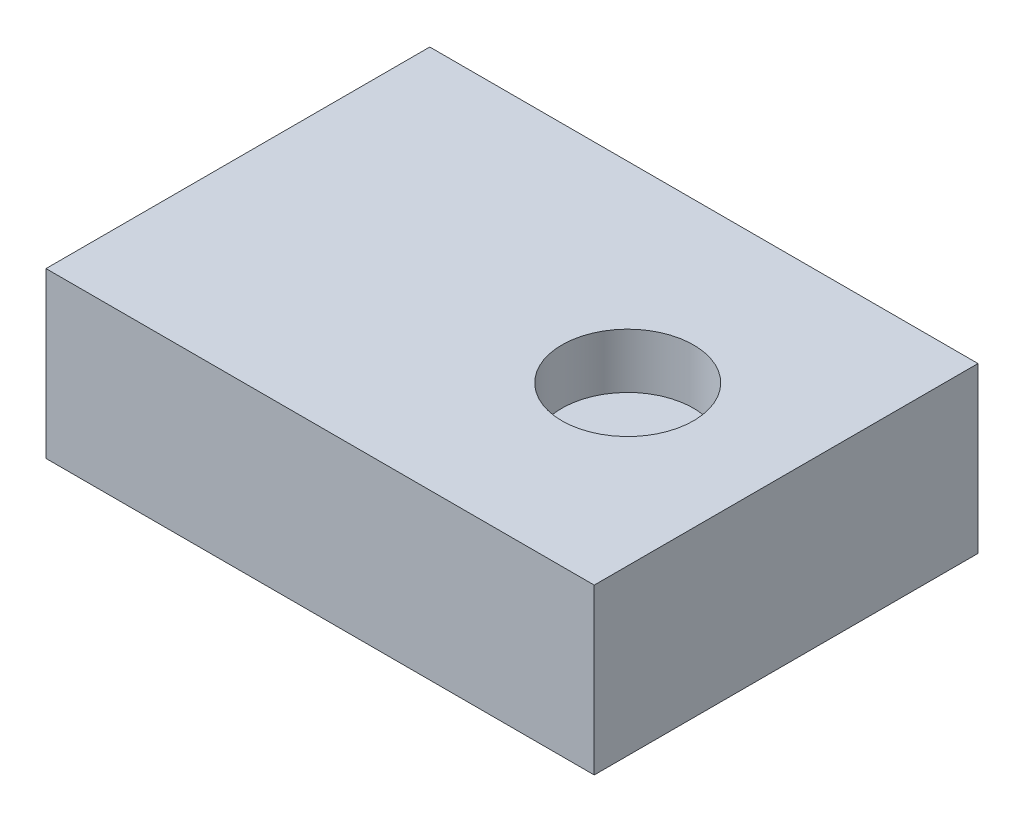
ISO-10303-21;
HEADER;
FILE_DESCRIPTION(('STEP AP214'),'2;1');
FILE_NAME('part.step','',(''),(''),'','','');
FILE_SCHEMA(('AUTOMOTIVE_DESIGN { 1 0 10303 214 1 1 1 1 }'));
ENDSEC;
DATA;
#1=APPLICATION_CONTEXT('core data for automotive mechanical design processes');
#2=APPLICATION_PROTOCOL_DEFINITION('international standard','automotive_design',2000,#1);
#3=PRODUCT_CONTEXT('',#1,'mechanical');
#4=PRODUCT('Part','Part','',(#3));
#5=PRODUCT_RELATED_PRODUCT_CATEGORY('part','',(#4));
#6=PRODUCT_DEFINITION_FORMATION('','',#4);
#7=PRODUCT_DEFINITION_CONTEXT('part definition',#1,'design');
#8=PRODUCT_DEFINITION('design','',#6,#7);
#9=PRODUCT_DEFINITION_SHAPE('','',#8);
#10=(LENGTH_UNIT() NAMED_UNIT(*) SI_UNIT(.MILLI.,.METRE.));
#11=(NAMED_UNIT(*) PLANE_ANGLE_UNIT() SI_UNIT($,.RADIAN.));
#12=(NAMED_UNIT(*) SI_UNIT($,.STERADIAN.) SOLID_ANGLE_UNIT());
#13=UNCERTAINTY_MEASURE_WITH_UNIT(LENGTH_MEASURE(1.E-05),#10,'distance_accuracy_value','');
#14=(GEOMETRIC_REPRESENTATION_CONTEXT(3) GLOBAL_UNCERTAINTY_ASSIGNED_CONTEXT((#13)) GLOBAL_UNIT_ASSIGNED_CONTEXT((#10,
#11,#12)) REPRESENTATION_CONTEXT('',''));
#15=CARTESIAN_POINT('',(0.,0.,0.));
#16=DIRECTION('',(0.,0.,1.));
#17=DIRECTION('',(1.,0.,0.));
#18=AXIS2_PLACEMENT_3D('',#15,#16,#17);
#19=CARTESIAN_POINT('',(-63.0679314748491,30.,-51.729247319518));
#20=DIRECTION('',(1.,0.,0.));
#21=DIRECTION('',(0.,0.,-1.));
#22=AXIS2_PLACEMENT_3D('',#19,#20,#21);
#23=PLANE('',#22);
#24=DIRECTION('',(0.,0.,1.));
#25=VECTOR('',#24,1.);
#26=CARTESIAN_POINT('',(-63.0679314748491,0.,-51.729247319518));
#27=LINE('',#26,#25);
#28=CARTESIAN_POINT('',(-63.0679314748491,0.,-51.729247319518));
#29=VERTEX_POINT('',#28);
#30=CARTESIAN_POINT('',(-63.0679314748491,0.,18.270752680482));
#31=VERTEX_POINT('',#30);
#32=EDGE_CURVE('E100',#29,#31,#27,.T.);
#33=ORIENTED_EDGE('',*,*,#32,.T.);
#34=DIRECTION('',(0.,-1.,0.));
#35=VECTOR('',#34,1.);
#36=CARTESIAN_POINT('',(-63.0679314748491,30.,18.270752680482));
#37=LINE('',#36,#35);
#38=CARTESIAN_POINT('',(-63.0679314748491,30.,18.270752680482));
#39=VERTEX_POINT('',#38);
#40=EDGE_CURVE('E11',#39,#31,#37,.T.);
#41=ORIENTED_EDGE('',*,*,#40,.F.);
#42=DIRECTION('',(0.,0.,1.));
#43=VECTOR('',#42,1.);
#44=CARTESIAN_POINT('',(-63.0679314748491,30.,-51.729247319518));
#45=LINE('',#44,#43);
#46=CARTESIAN_POINT('',(-63.0679314748491,30.,-51.729247319518));
#47=VERTEX_POINT('',#46);
#48=EDGE_CURVE('E88',#47,#39,#45,.T.);
#49=ORIENTED_EDGE('',*,*,#48,.F.);
#50=DIRECTION('',(0.,-1.,0.));
#51=VECTOR('',#50,1.);
#52=CARTESIAN_POINT('',(-63.0679314748491,30.,-51.729247319518));
#53=LINE('',#52,#51);
#54=EDGE_CURVE('E96',#47,#29,#53,.T.);
#55=ORIENTED_EDGE('',*,*,#54,.T.);
#56=EDGE_LOOP('',(#33,#41,#49,#55));
#57=FACE_BOUND('',#56,.T.);
#58=ADVANCED_FACE('F37',(#57),#23,.F.);
#59=CARTESIAN_POINT('',(-63.0679314748491,30.,18.270752680482));
#60=DIRECTION('',(0.,0.,-1.));
#61=DIRECTION('',(-1.,0.,0.));
#62=AXIS2_PLACEMENT_3D('',#59,#60,#61);
#63=PLANE('',#62);
#64=DIRECTION('',(1.,0.,0.));
#65=VECTOR('',#64,1.);
#66=CARTESIAN_POINT('',(-63.0679314748491,0.,18.270752680482));
#67=LINE('',#66,#65);
#68=CARTESIAN_POINT('',(36.9320685251509,0.,18.270752680482));
#69=VERTEX_POINT('',#68);
#70=EDGE_CURVE('E92',#31,#69,#67,.T.);
#71=ORIENTED_EDGE('',*,*,#70,.T.);
#72=DIRECTION('',(0.,-1.,0.));
#73=VECTOR('',#72,1.);
#74=CARTESIAN_POINT('',(36.9320685251509,30.,18.270752680482));
#75=LINE('',#74,#73);
#76=CARTESIAN_POINT('',(36.9320685251509,30.,18.270752680482));
#77=VERTEX_POINT('',#76);
#78=EDGE_CURVE('E45',#77,#69,#75,.T.);
#79=ORIENTED_EDGE('',*,*,#78,.F.);
#80=DIRECTION('',(1.,0.,0.));
#81=VECTOR('',#80,1.);
#82=CARTESIAN_POINT('',(-63.0679314748491,30.,18.270752680482));
#83=LINE('',#82,#81);
#84=EDGE_CURVE('E83',#39,#77,#83,.T.);
#85=ORIENTED_EDGE('',*,*,#84,.F.);
#86=ORIENTED_EDGE('',*,*,#40,.T.);
#87=EDGE_LOOP('',(#71,#79,#85,#86));
#88=FACE_BOUND('',#87,.T.);
#89=ADVANCED_FACE('F91',(#88),#63,.F.);
#90=CARTESIAN_POINT('',(36.9320685251509,30.,-51.729247319518));
#91=DIRECTION('',(-1.,0.,0.));
#92=DIRECTION('',(0.,0.,1.));
#93=AXIS2_PLACEMENT_3D('',#90,#91,#92);
#94=PLANE('',#93);
#95=DIRECTION('',(0.,0.,-1.));
#96=VECTOR('',#95,1.);
#97=CARTESIAN_POINT('',(36.9320685251509,0.,-51.729247319518));
#98=LINE('',#97,#96);
#99=CARTESIAN_POINT('',(36.9320685251509,0.,-51.729247319518));
#100=VERTEX_POINT('',#99);
#101=EDGE_CURVE('E70',#69,#100,#98,.T.);
#102=ORIENTED_EDGE('',*,*,#101,.T.);
#103=DIRECTION('',(0.,-1.,0.));
#104=VECTOR('',#103,1.);
#105=CARTESIAN_POINT('',(36.9320685251509,30.,-51.729247319518));
#106=LINE('',#105,#104);
#107=CARTESIAN_POINT('',(36.9320685251509,30.,-51.729247319518));
#108=VERTEX_POINT('',#107);
#109=EDGE_CURVE('E93',#108,#100,#106,.T.);
#110=ORIENTED_EDGE('',*,*,#109,.F.);
#111=DIRECTION('',(0.,0.,-1.));
#112=VECTOR('',#111,1.);
#113=CARTESIAN_POINT('',(36.9320685251509,30.,-51.729247319518));
#114=LINE('',#113,#112);
#115=EDGE_CURVE('E86',#77,#108,#114,.T.);
#116=ORIENTED_EDGE('',*,*,#115,.F.);
#117=ORIENTED_EDGE('',*,*,#78,.T.);
#118=EDGE_LOOP('',(#102,#110,#116,#117));
#119=FACE_BOUND('',#118,.T.);
#120=ADVANCED_FACE('F94',(#119),#94,.F.);
#121=CARTESIAN_POINT('',(-63.0679314748491,30.,-51.729247319518));
#122=DIRECTION('',(0.,0.,1.));
#123=DIRECTION('',(1.,0.,0.));
#124=AXIS2_PLACEMENT_3D('',#121,#122,#123);
#125=PLANE('',#124);
#126=DIRECTION('',(-1.,0.,0.));
#127=VECTOR('',#126,1.);
#128=CARTESIAN_POINT('',(-63.0679314748491,0.,-51.729247319518));
#129=LINE('',#128,#127);
#130=EDGE_CURVE('E76',#100,#29,#129,.T.);
#131=ORIENTED_EDGE('',*,*,#130,.T.);
#132=ORIENTED_EDGE('',*,*,#54,.F.);
#133=DIRECTION('',(-1.,0.,0.));
#134=VECTOR('',#133,1.);
#135=CARTESIAN_POINT('',(-63.0679314748491,30.,-51.729247319518));
#136=LINE('',#135,#134);
#137=EDGE_CURVE('E53',#108,#47,#136,.T.);
#138=ORIENTED_EDGE('',*,*,#137,.F.);
#139=ORIENTED_EDGE('',*,*,#109,.T.);
#140=EDGE_LOOP('',(#131,#132,#138,#139));
#141=FACE_BOUND('',#140,.T.);
#142=ADVANCED_FACE('F108',(#141),#125,.F.);
#143=CARTESIAN_POINT('',(0.,30.,0.));
#144=DIRECTION('',(0.,1.,0.));
#145=DIRECTION('',(0.,0.,1.));
#146=AXIS2_PLACEMENT_3D('',#143,#144,#145);
#147=PLANE('',#146);
#148=CARTESIAN_POINT('',(8.0391979095964,30.,-16.729247319518));
#149=DIRECTION('',(0.,1.,0.));
#150=DIRECTION('',(0.,0.,1.));
#151=AXIS2_PLACEMENT_3D('',#148,#149,#150);
#152=CIRCLE('',#151,12.);
#153=CARTESIAN_POINT('',(8.0391979095964,30.,-4.72924731951797));
#154=VERTEX_POINT('',#153);
#155=EDGE_CURVE('E114',#154,#154,#152,.T.);
#156=ORIENTED_EDGE('',*,*,#155,.F.);
#157=EDGE_LOOP('',(#156));
#158=FACE_BOUND('',#157,.T.);
#159=ORIENTED_EDGE('',*,*,#48,.T.);
#160=ORIENTED_EDGE('',*,*,#84,.T.);
#161=ORIENTED_EDGE('',*,*,#115,.T.);
#162=ORIENTED_EDGE('',*,*,#137,.T.);
#163=EDGE_LOOP('',(#159,#160,#161,#162));
#164=FACE_BOUND('',#163,.T.);
#165=ADVANCED_FACE('F84',(#158,#164),#147,.T.);
#166=CARTESIAN_POINT('',(0.,0.,0.));
#167=DIRECTION('',(0.,1.,0.));
#168=DIRECTION('',(0.,0.,1.));
#169=AXIS2_PLACEMENT_3D('',#166,#167,#168);
#170=PLANE('',#169);
#171=ORIENTED_EDGE('',*,*,#32,.F.);
#172=ORIENTED_EDGE('',*,*,#130,.F.);
#173=ORIENTED_EDGE('',*,*,#101,.F.);
#174=ORIENTED_EDGE('',*,*,#70,.F.);
#175=EDGE_LOOP('',(#171,#172,#173,#174));
#176=FACE_BOUND('',#175,.T.);
#177=ADVANCED_FACE('F111',(#176),#170,.F.);
#178=CARTESIAN_POINT('',(8.0391979095964,20.,-16.729247319518));
#179=DIRECTION('',(0.,1.,0.));
#180=DIRECTION('',(0.,0.,1.));
#181=AXIS2_PLACEMENT_3D('',#178,#179,#180);
#182=CYLINDRICAL_SURFACE('',#181,12.);
#183=CARTESIAN_POINT('',(8.0391979095964,20.,-16.729247319518));
#184=DIRECTION('',(0.,1.,0.));
#185=DIRECTION('',(0.,0.,1.));
#186=AXIS2_PLACEMENT_3D('',#183,#184,#185);
#187=CIRCLE('',#186,12.);
#188=CARTESIAN_POINT('',(8.0391979095964,20.,-4.72924731951797));
#189=VERTEX_POINT('',#188);
#190=EDGE_CURVE('E103',#189,#189,#187,.T.);
#191=ORIENTED_EDGE('',*,*,#190,.F.);
#192=EDGE_LOOP('',(#191));
#193=FACE_BOUND('',#192,.T.);
#194=ORIENTED_EDGE('',*,*,#155,.T.);
#195=EDGE_LOOP('',(#194));
#196=FACE_BOUND('',#195,.T.);
#197=ADVANCED_FACE('F122',(#193,#196),#182,.F.);
#198=CARTESIAN_POINT('',(8.0391979095964,20.,-16.729247319518));
#199=DIRECTION('',(0.,1.,0.));
#200=DIRECTION('',(0.,0.,1.));
#201=AXIS2_PLACEMENT_3D('',#198,#199,#200);
#202=PLANE('',#201);
#203=ORIENTED_EDGE('',*,*,#190,.T.);
#204=EDGE_LOOP('',(#203));
#205=FACE_BOUND('',#204,.T.);
#206=ADVANCED_FACE('F120',(#205),#202,.T.);
#207=CLOSED_SHELL('',(#58,#89,#120,#142,#165,#177,#197,#206));
#208=MANIFOLD_SOLID_BREP('B2',#207);
#209=ADVANCED_BREP_SHAPE_REPRESENTATION('',(#18,#208),#14);
#210=SHAPE_DEFINITION_REPRESENTATION(#9,#209);
ENDSEC;
END-ISO-10303-21;
